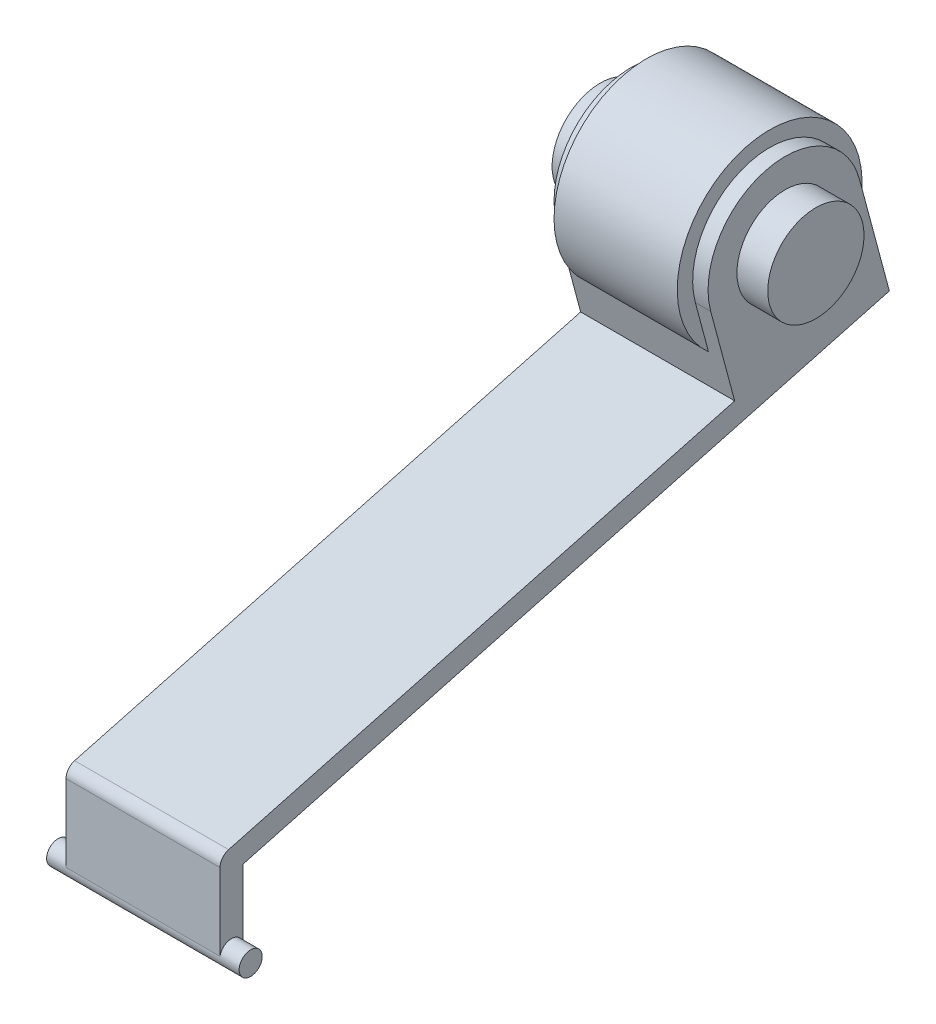
ISO-10303-21;
HEADER;
FILE_DESCRIPTION(('STEP AP214'),'2;1');
FILE_NAME('part.step','',(''),(''),'','','');
FILE_SCHEMA(('AUTOMOTIVE_DESIGN { 1 0 10303 214 1 1 1 1 }'));
ENDSEC;
DATA;
#1=APPLICATION_CONTEXT('core data for automotive mechanical design processes');
#2=APPLICATION_PROTOCOL_DEFINITION('international standard','automotive_design',2000,#1);
#3=PRODUCT_CONTEXT('',#1,'mechanical');
#4=PRODUCT('Part','Part','',(#3));
#5=PRODUCT_RELATED_PRODUCT_CATEGORY('part','',(#4));
#6=PRODUCT_DEFINITION_FORMATION('','',#4);
#7=PRODUCT_DEFINITION_CONTEXT('part definition',#1,'design');
#8=PRODUCT_DEFINITION('design','',#6,#7);
#9=PRODUCT_DEFINITION_SHAPE('','',#8);
#10=(LENGTH_UNIT() NAMED_UNIT(*) SI_UNIT(.MILLI.,.METRE.));
#11=(NAMED_UNIT(*) PLANE_ANGLE_UNIT() SI_UNIT($,.RADIAN.));
#12=(NAMED_UNIT(*) SI_UNIT($,.STERADIAN.) SOLID_ANGLE_UNIT());
#13=UNCERTAINTY_MEASURE_WITH_UNIT(LENGTH_MEASURE(1.E-05),#10,'distance_accuracy_value','');
#14=(GEOMETRIC_REPRESENTATION_CONTEXT(3) GLOBAL_UNCERTAINTY_ASSIGNED_CONTEXT((#13)) GLOBAL_UNIT_ASSIGNED_CONTEXT((#10,
#11,#12)) REPRESENTATION_CONTEXT('',''));
#15=CARTESIAN_POINT('',(0.,0.,0.));
#16=DIRECTION('',(0.,0.,1.));
#17=DIRECTION('',(1.,0.,0.));
#18=AXIS2_PLACEMENT_3D('',#15,#16,#17);
#19=CARTESIAN_POINT('',(-2.,8.1855285349606,-12.4450213943224));
#20=DIRECTION('',(0.,-0.258819045102509,0.965925826289071));
#21=DIRECTION('',(0.,-0.965925826289071,-0.258819045102509));
#22=AXIS2_PLACEMENT_3D('',#19,#20,#21);
#23=PLANE('',#22);
#24=DIRECTION('',(1.,0.,0.));
#25=VECTOR('',#24,1.);
#26=CARTESIAN_POINT('',(-1.6,6.90408311851465,-12.7883836588037));
#27=LINE('',#26,#25);
#28=CARTESIAN_POINT('',(-1.6,6.90408311851465,-12.7883836588037));
#29=VERTEX_POINT('',#28);
#30=CARTESIAN_POINT('',(1.6,6.90408311851465,-12.7883836588037));
#31=VERTEX_POINT('',#30);
#32=EDGE_CURVE('E61',#29,#31,#27,.T.);
#33=ORIENTED_EDGE('',*,*,#32,.F.);
#34=DIRECTION('',(0.,0.965925826289071,0.258819045102509));
#35=VECTOR('',#34,1.);
#36=CARTESIAN_POINT('',(-1.6,8.1855285349606,-12.4450213943224));
#37=LINE('',#36,#35);
#38=CARTESIAN_POINT('',(-1.6,8.1855285349606,-12.4450213943224));
#39=VERTEX_POINT('',#38);
#40=EDGE_CURVE('E191',#29,#39,#37,.T.);
#41=ORIENTED_EDGE('',*,*,#40,.T.);
#42=DIRECTION('',(1.,0.,0.));
#43=VECTOR('',#42,1.);
#44=CARTESIAN_POINT('',(-2.,8.1855285349606,-12.4450213943224));
#45=LINE('',#44,#43);
#46=CARTESIAN_POINT('',(-2.,8.1855285349606,-12.4450213943224));
#47=VERTEX_POINT('',#46);
#48=EDGE_CURVE('E220',#47,#39,#45,.T.);
#49=ORIENTED_EDGE('',*,*,#48,.F.);
#50=DIRECTION('',(0.,-0.965925826289071,-0.258819045102509));
#51=VECTOR('',#50,1.);
#52=CARTESIAN_POINT('',(-2.,8.1855285349606,-12.4450213943224));
#53=LINE('',#52,#51);
#54=CARTESIAN_POINT('',(-2.,5.85998708642784,-13.0681483474219));
#55=VERTEX_POINT('',#54);
#56=EDGE_CURVE('E197',#47,#55,#53,.T.);
#57=ORIENTED_EDGE('',*,*,#56,.T.);
#58=DIRECTION('',(1.,0.,0.));
#59=VECTOR('',#58,1.);
#60=CARTESIAN_POINT('',(-2.,5.85998708642784,-13.0681483474219));
#61=LINE('',#60,#59);
#62=CARTESIAN_POINT('',(2.,5.85998708642784,-13.0681483474219));
#63=VERTEX_POINT('',#62);
#64=EDGE_CURVE('E224',#55,#63,#61,.T.);
#65=ORIENTED_EDGE('',*,*,#64,.T.);
#66=DIRECTION('',(0.,-0.965925826289071,-0.258819045102509));
#67=VECTOR('',#66,1.);
#68=CARTESIAN_POINT('',(2.,8.1855285349606,-12.4450213943224));
#69=LINE('',#68,#67);
#70=CARTESIAN_POINT('',(2.,8.1855285349606,-12.4450213943224));
#71=VERTEX_POINT('',#70);
#72=EDGE_CURVE('E196',#71,#63,#69,.T.);
#73=ORIENTED_EDGE('',*,*,#72,.F.);
#74=CARTESIAN_POINT('',(1.6,8.1855285349606,-12.4450213943224));
#75=VERTEX_POINT('',#74);
#76=EDGE_CURVE('E225',#75,#71,#45,.T.);
#77=ORIENTED_EDGE('',*,*,#76,.F.);
#78=DIRECTION('',(0.,0.965925826289071,0.258819045102509));
#79=VECTOR('',#78,1.);
#80=CARTESIAN_POINT('',(1.6,8.1855285349606,-12.4450213943224));
#81=LINE('',#80,#79);
#82=EDGE_CURVE('E69',#31,#75,#81,.T.);
#83=ORIENTED_EDGE('',*,*,#82,.F.);
#84=EDGE_LOOP('',(#33,#41,#49,#57,#65,#73,#77,#83));
#85=FACE_BOUND('',#84,.T.);
#86=ADVANCED_FACE('F40',(#85),#23,.T.);
#87=CARTESIAN_POINT('',(-2.,8.70316662516563,-14.3768730469006));
#88=DIRECTION('',(1.,0.,0.));
#89=DIRECTION('',(0.,0.,-1.));
#90=AXIS2_PLACEMENT_3D('',#87,#88,#89);
#91=CYLINDRICAL_SURFACE('',#90,1.99999999999998);
#92=ORIENTED_EDGE('',*,*,#48,.T.);
#93=CARTESIAN_POINT('',(-1.6,8.70316662516563,-14.3768730469006));
#94=DIRECTION('',(1.,0.,0.));
#95=DIRECTION('',(0.,0.,-1.));
#96=AXIS2_PLACEMENT_3D('',#93,#94,#95);
#97=CIRCLE('',#96,1.99999999999998);
#98=CARTESIAN_POINT('',(-1.6,9.22080471537066,-16.3087246994787));
#99=VERTEX_POINT('',#98);
#100=EDGE_CURVE('E188',#39,#99,#97,.F.);
#101=ORIENTED_EDGE('',*,*,#100,.T.);
#102=DIRECTION('',(1.,0.,0.));
#103=VECTOR('',#102,1.);
#104=CARTESIAN_POINT('',(-2.,9.22080471537066,-16.3087246994787));
#105=LINE('',#104,#103);
#106=CARTESIAN_POINT('',(-2.,9.22080471537066,-16.3087246994787));
#107=VERTEX_POINT('',#106);
#108=EDGE_CURVE('E226',#107,#99,#105,.T.);
#109=ORIENTED_EDGE('',*,*,#108,.F.);
#110=CARTESIAN_POINT('',(-2.,8.70316662516563,-14.3768730469006));
#111=DIRECTION('',(1.,0.,0.));
#112=DIRECTION('',(0.,0.,-1.));
#113=AXIS2_PLACEMENT_3D('',#110,#111,#112);
#114=CIRCLE('',#113,1.99999999999998);
#115=EDGE_CURVE('E205',#107,#47,#114,.T.);
#116=ORIENTED_EDGE('',*,*,#115,.T.);
#117=EDGE_LOOP('',(#92,#101,#109,#116));
#118=FACE_BOUND('',#117,.T.);
#119=ADVANCED_FACE('F309',(#118),#91,.T.);
#120=CARTESIAN_POINT('',(-2.,6.32302723650344,-17.0851818347863));
#121=DIRECTION('',(0.,0.258819045102519,-0.965925826289069));
#122=DIRECTION('',(0.,0.965925826289069,0.258819045102519));
#123=AXIS2_PLACEMENT_3D('',#120,#121,#122);
#124=PLANE('',#123);
#125=ORIENTED_EDGE('',*,*,#108,.T.);
#126=DIRECTION('',(0.,-0.965925826289069,-0.258819045102519));
#127=VECTOR('',#126,1.);
#128=CARTESIAN_POINT('',(-1.6,6.32302723650344,-17.0851818347863));
#129=LINE('',#128,#127);
#130=CARTESIAN_POINT('',(-1.6,7.93935929892469,-16.6520869639599));
#131=VERTEX_POINT('',#130);
#132=EDGE_CURVE('E50',#99,#131,#129,.T.);
#133=ORIENTED_EDGE('',*,*,#132,.T.);
#134=DIRECTION('',(1.,0.,0.));
#135=VECTOR('',#134,1.);
#136=CARTESIAN_POINT('',(-1.6,7.93935929892469,-16.6520869639599));
#137=LINE('',#136,#135);
#138=CARTESIAN_POINT('',(1.6,7.93935929892469,-16.6520869639599));
#139=VERTEX_POINT('',#138);
#140=EDGE_CURVE('E150',#139,#131,#137,.F.);
#141=ORIENTED_EDGE('',*,*,#140,.F.);
#142=DIRECTION('',(0.,-0.965925826289069,-0.258819045102519));
#143=VECTOR('',#142,1.);
#144=CARTESIAN_POINT('',(1.6,6.32302723650344,-17.0851818347863));
#145=LINE('',#144,#143);
#146=CARTESIAN_POINT('',(1.6,9.22080471537066,-16.3087246994787));
#147=VERTEX_POINT('',#146);
#148=EDGE_CURVE('E154',#147,#139,#145,.T.);
#149=ORIENTED_EDGE('',*,*,#148,.F.);
#150=CARTESIAN_POINT('',(2.,9.22080471537066,-16.3087246994787));
#151=VERTEX_POINT('',#150);
#152=EDGE_CURVE('E229',#147,#151,#105,.T.);
#153=ORIENTED_EDGE('',*,*,#152,.T.);
#154=DIRECTION('',(0.,0.965925826289069,0.258819045102519));
#155=VECTOR('',#154,1.);
#156=CARTESIAN_POINT('',(2.,6.32302723650344,-17.0851818347863));
#157=LINE('',#156,#155);
#158=CARTESIAN_POINT('',(2.,6.32302723650344,-17.0851818347863));
#159=VERTEX_POINT('',#158);
#160=EDGE_CURVE('E213',#159,#151,#157,.T.);
#161=ORIENTED_EDGE('',*,*,#160,.F.);
#162=DIRECTION('',(1.,0.,0.));
#163=VECTOR('',#162,1.);
#164=CARTESIAN_POINT('',(-2.,6.32302723650344,-17.0851818347863));
#165=LINE('',#164,#163);
#166=CARTESIAN_POINT('',(-2.,6.32302723650344,-17.0851818347863));
#167=VERTEX_POINT('',#166);
#168=EDGE_CURVE('E209',#167,#159,#165,.T.);
#169=ORIENTED_EDGE('',*,*,#168,.F.);
#170=DIRECTION('',(0.,0.965925826289069,0.258819045102519));
#171=VECTOR('',#170,1.);
#172=CARTESIAN_POINT('',(-2.,6.32302723650344,-17.0851818347863));
#173=LINE('',#172,#171);
#174=EDGE_CURVE('E200',#167,#107,#173,.T.);
#175=ORIENTED_EDGE('',*,*,#174,.T.);
#176=EDGE_LOOP('',(#125,#133,#141,#149,#153,#161,#169,#175));
#177=FACE_BOUND('',#176,.T.);
#178=ADVANCED_FACE('F153',(#177),#124,.T.);
#179=CARTESIAN_POINT('',(2.5,0.,0.));
#180=DIRECTION('',(-1.,0.,0.));
#181=DIRECTION('',(0.,0.,1.));
#182=AXIS2_PLACEMENT_3D('',#179,#180,#181);
#183=CYLINDRICAL_SURFACE('',#182,0.3);
#184=DIRECTION('',(1.,0.,0.));
#185=VECTOR('',#184,1.);
#186=CARTESIAN_POINT('',(-2.,0.047528362088004,0.29621116588885));
#187=LINE('',#186,#185);
#188=CARTESIAN_POINT('',(-2.,0.0475283620880039,0.29621116588885));
#189=VERTEX_POINT('',#188);
#190=CARTESIAN_POINT('',(2.,0.0475283620880039,0.29621116588885));
#191=VERTEX_POINT('',#190);
#192=EDGE_CURVE('E265',#189,#191,#187,.T.);
#193=ORIENTED_EDGE('',*,*,#192,.F.);
#194=CARTESIAN_POINT('',(-2.,0.,0.));
#195=DIRECTION('',(-1.,0.,0.));
#196=DIRECTION('',(0.,0.,1.));
#197=AXIS2_PLACEMENT_3D('',#194,#195,#196);
#198=CIRCLE('',#197,0.3);
#199=CARTESIAN_POINT('',(-2.,0.0475283620880039,-0.29621116588885));
#200=VERTEX_POINT('',#199);
#201=EDGE_CURVE('E170',#189,#200,#198,.T.);
#202=ORIENTED_EDGE('',*,*,#201,.T.);
#203=DIRECTION('',(1.,0.,0.));
#204=VECTOR('',#203,1.);
#205=CARTESIAN_POINT('',(-2.,0.047528362088004,-0.29621116588885));
#206=LINE('',#205,#204);
#207=CARTESIAN_POINT('',(2.,0.047528362088004,-0.29621116588885));
#208=VERTEX_POINT('',#207);
#209=EDGE_CURVE('E264',#200,#208,#206,.T.);
#210=ORIENTED_EDGE('',*,*,#209,.T.);
#211=CARTESIAN_POINT('',(2.,0.,0.));
#212=DIRECTION('',(-1.,0.,0.));
#213=DIRECTION('',(0.,0.,1.));
#214=AXIS2_PLACEMENT_3D('',#211,#212,#213);
#215=CIRCLE('',#214,0.3);
#216=EDGE_CURVE('E280',#191,#208,#215,.T.);
#217=ORIENTED_EDGE('',*,*,#216,.F.);
#218=EDGE_LOOP('',(#193,#202,#210,#217));
#219=FACE_BOUND('',#218,.T.);
#220=CARTESIAN_POINT('',(2.5,0.,0.));
#221=DIRECTION('',(1.,0.,0.));
#222=DIRECTION('',(0.,0.,-1.));
#223=AXIS2_PLACEMENT_3D('',#220,#221,#222);
#224=CIRCLE('',#223,0.3);
#225=CARTESIAN_POINT('',(2.5,0.,-0.3));
#226=VERTEX_POINT('',#225);
#227=EDGE_CURVE('E277',#226,#226,#224,.T.);
#228=ORIENTED_EDGE('',*,*,#227,.F.);
#229=EDGE_LOOP('',(#228));
#230=FACE_BOUND('',#229,.T.);
#231=CARTESIAN_POINT('',(-2.5,0.,0.));
#232=DIRECTION('',(1.,0.,0.));
#233=DIRECTION('',(0.,0.,-1.));
#234=AXIS2_PLACEMENT_3D('',#231,#232,#233);
#235=CIRCLE('',#234,0.3);
#236=CARTESIAN_POINT('',(-2.5,0.,-0.3));
#237=VERTEX_POINT('',#236);
#238=EDGE_CURVE('E268',#237,#237,#235,.T.);
#239=ORIENTED_EDGE('',*,*,#238,.T.);
#240=EDGE_LOOP('',(#239));
#241=FACE_BOUND('',#240,.T.);
#242=ADVANCED_FACE('F42',(#219,#230,#241),#183,.T.);
#243=CARTESIAN_POINT('',(2.5,0.,0.));
#244=DIRECTION('',(1.,0.,0.));
#245=DIRECTION('',(0.,0.,-1.));
#246=AXIS2_PLACEMENT_3D('',#243,#244,#245);
#247=PLANE('',#246);
#248=ORIENTED_EDGE('',*,*,#227,.T.);
#249=EDGE_LOOP('',(#248));
#250=FACE_BOUND('',#249,.T.);
#251=ADVANCED_FACE('F348',(#250),#247,.T.);
#252=CARTESIAN_POINT('',(-2.5,0.,0.));
#253=DIRECTION('',(1.,0.,0.));
#254=DIRECTION('',(0.,0.,-1.));
#255=AXIS2_PLACEMENT_3D('',#252,#253,#254);
#256=PLANE('',#255);
#257=ORIENTED_EDGE('',*,*,#238,.F.);
#258=EDGE_LOOP('',(#257));
#259=FACE_BOUND('',#258,.T.);
#260=ADVANCED_FACE('F332',(#259),#256,.F.);
#261=CARTESIAN_POINT('',(-2.,0.047528362088004,0.29621116588885));
#262=DIRECTION('',(0.,0.,1.));
#263=DIRECTION('',(0.,-1.,0.));
#264=AXIS2_PLACEMENT_3D('',#261,#262,#263);
#265=PLANE('',#264);
#266=ORIENTED_EDGE('',*,*,#192,.T.);
#267=DIRECTION('',(0.,-1.,0.));
#268=VECTOR('',#267,1.);
#269=CARTESIAN_POINT('',(2.,0.047528362088004,0.29621116588885));
#270=LINE('',#269,#268);
#271=CARTESIAN_POINT('',(2.,2.047528362088,0.296211165888849));
#272=VERTEX_POINT('',#271);
#273=EDGE_CURVE('E246',#272,#191,#270,.T.);
#274=ORIENTED_EDGE('',*,*,#273,.F.);
#275=DIRECTION('',(1.,0.,0.));
#276=VECTOR('',#275,1.);
#277=CARTESIAN_POINT('',(-2.,2.047528362088,0.296211165888849));
#278=LINE('',#277,#276);
#279=CARTESIAN_POINT('',(-2.,2.047528362088,0.296211165888849));
#280=VERTEX_POINT('',#279);
#281=EDGE_CURVE('E269',#280,#272,#278,.T.);
#282=ORIENTED_EDGE('',*,*,#281,.F.);
#283=DIRECTION('',(0.,-1.,0.));
#284=VECTOR('',#283,1.);
#285=CARTESIAN_POINT('',(-2.,0.047528362088004,0.29621116588885));
#286=LINE('',#285,#284);
#287=EDGE_CURVE('E261',#280,#189,#286,.T.);
#288=ORIENTED_EDGE('',*,*,#287,.T.);
#289=EDGE_LOOP('',(#266,#274,#282,#288));
#290=FACE_BOUND('',#289,.T.);
#291=ADVANCED_FACE('F328',(#290),#265,.T.);
#292=CARTESIAN_POINT('',(-2.,2.047528362088,-0.00547167469361001));
#293=DIRECTION('',(1.,0.,0.));
#294=DIRECTION('',(0.,0.,-1.));
#295=AXIS2_PLACEMENT_3D('',#292,#293,#294);
#296=CYLINDRICAL_SURFACE('',#295,0.301682840582459);
#297=ORIENTED_EDGE('',*,*,#281,.T.);
#298=CARTESIAN_POINT('',(2.,2.047528362088,-0.00547167469361001));
#299=DIRECTION('',(1.,0.,0.));
#300=DIRECTION('',(0.,0.,1.));
#301=AXIS2_PLACEMENT_3D('',#298,#299,#300);
#302=CIRCLE('',#301,0.301682840582459);
#303=CARTESIAN_POINT('',(2.,2.33893160915485,0.0726095900297573));
#304=VERTEX_POINT('',#303);
#305=EDGE_CURVE('E243',#304,#272,#302,.T.);
#306=ORIENTED_EDGE('',*,*,#305,.F.);
#307=DIRECTION('',(1.,0.,0.));
#308=VECTOR('',#307,1.);
#309=CARTESIAN_POINT('',(-2.,2.33893160915485,0.0726095900297573));
#310=LINE('',#309,#308);
#311=CARTESIAN_POINT('',(-2.,2.33893160915485,0.0726095900297573));
#312=VERTEX_POINT('',#311);
#313=EDGE_CURVE('E271',#312,#304,#310,.T.);
#314=ORIENTED_EDGE('',*,*,#313,.F.);
#315=CARTESIAN_POINT('',(-2.,2.047528362088,-0.00547167469361001));
#316=DIRECTION('',(1.,0.,0.));
#317=DIRECTION('',(0.,0.,1.));
#318=AXIS2_PLACEMENT_3D('',#315,#316,#317);
#319=CIRCLE('',#318,0.301682840582459);
#320=EDGE_CURVE('E258',#312,#280,#319,.T.);
#321=ORIENTED_EDGE('',*,*,#320,.T.);
#322=EDGE_LOOP('',(#297,#306,#314,#321));
#323=FACE_BOUND('',#322,.T.);
#324=ADVANCED_FACE('F331',(#323),#296,.T.);
#325=CARTESIAN_POINT('',(-2.,2.33893160915485,0.0726095900297573));
#326=DIRECTION('',(0.,0.965925826289069,0.258819045102518));
#327=DIRECTION('',(0.,-0.258819045102518,0.965925826289069));
#328=AXIS2_PLACEMENT_3D('',#325,#326,#327);
#329=PLANE('',#328);
#330=ORIENTED_EDGE('',*,*,#64,.F.);
#331=DIRECTION('',(0.,-0.258819045102518,0.965925826289069));
#332=VECTOR('',#331,1.);
#333=CARTESIAN_POINT('',(-2.,2.33893160915485,0.0726095900297573));
#334=LINE('',#333,#332);
#335=EDGE_CURVE('E255',#55,#312,#334,.T.);
#336=ORIENTED_EDGE('',*,*,#335,.T.);
#337=ORIENTED_EDGE('',*,*,#313,.T.);
#338=DIRECTION('',(0.,-0.258819045102518,0.965925826289069));
#339=VECTOR('',#338,1.);
#340=CARTESIAN_POINT('',(2.,2.33893160915485,0.0726095900297573));
#341=LINE('',#340,#339);
#342=EDGE_CURVE('E240',#63,#304,#341,.T.);
#343=ORIENTED_EDGE('',*,*,#342,.F.);
#344=EDGE_LOOP('',(#330,#336,#337,#343));
#345=FACE_BOUND('',#344,.T.);
#346=ADVANCED_FACE('F336',(#345),#329,.T.);
#347=CARTESIAN_POINT('',(-2.,1.82443610402263,-0.29621116588885));
#348=DIRECTION('',(0.,-0.965925826289069,-0.258819045102518));
#349=DIRECTION('',(0.,0.258819045102518,-0.965925826289069));
#350=AXIS2_PLACEMENT_3D('',#347,#348,#349);
#351=PLANE('',#350);
#352=DIRECTION('',(0.,0.258819045102518,-0.965925826289069));
#353=VECTOR('',#352,1.);
#354=CARTESIAN_POINT('',(-2.,1.82443610402263,-0.29621116588885));
#355=LINE('',#354,#353);
#356=CARTESIAN_POINT('',(-2.,1.82443610402263,-0.29621116588885));
#357=VERTEX_POINT('',#356);
#358=EDGE_CURVE('E252',#357,#167,#355,.T.);
#359=ORIENTED_EDGE('',*,*,#358,.T.);
#360=ORIENTED_EDGE('',*,*,#168,.T.);
#361=DIRECTION('',(0.,0.258819045102518,-0.965925826289069));
#362=VECTOR('',#361,1.);
#363=CARTESIAN_POINT('',(2.,1.82443610402263,-0.29621116588885));
#364=LINE('',#363,#362);
#365=CARTESIAN_POINT('',(2.,1.82443610402263,-0.29621116588885));
#366=VERTEX_POINT('',#365);
#367=EDGE_CURVE('E237',#366,#159,#364,.T.);
#368=ORIENTED_EDGE('',*,*,#367,.F.);
#369=DIRECTION('',(1.,0.,0.));
#370=VECTOR('',#369,1.);
#371=CARTESIAN_POINT('',(-2.,1.82443610402263,-0.29621116588885));
#372=LINE('',#371,#370);
#373=EDGE_CURVE('E274',#357,#366,#372,.T.);
#374=ORIENTED_EDGE('',*,*,#373,.F.);
#375=EDGE_LOOP('',(#359,#360,#368,#374));
#376=FACE_BOUND('',#375,.T.);
#377=ADVANCED_FACE('F340',(#376),#351,.T.);
#378=CARTESIAN_POINT('',(-2.,1.82443610402263,-0.29621116588885));
#379=DIRECTION('',(0.,0.,-1.));
#380=DIRECTION('',(0.,1.,0.));
#381=AXIS2_PLACEMENT_3D('',#378,#379,#380);
#382=PLANE('',#381);
#383=ORIENTED_EDGE('',*,*,#373,.T.);
#384=DIRECTION('',(0.,1.,0.));
#385=VECTOR('',#384,1.);
#386=CARTESIAN_POINT('',(2.,1.82443610402263,-0.29621116588885));
#387=LINE('',#386,#385);
#388=EDGE_CURVE('E234',#208,#366,#387,.T.);
#389=ORIENTED_EDGE('',*,*,#388,.F.);
#390=ORIENTED_EDGE('',*,*,#209,.F.);
#391=DIRECTION('',(0.,1.,0.));
#392=VECTOR('',#391,1.);
#393=CARTESIAN_POINT('',(-2.,1.82443610402263,-0.29621116588885));
#394=LINE('',#393,#392);
#395=EDGE_CURVE('E249',#200,#357,#394,.T.);
#396=ORIENTED_EDGE('',*,*,#395,.T.);
#397=EDGE_LOOP('',(#383,#389,#390,#396));
#398=FACE_BOUND('',#397,.T.);
#399=ADVANCED_FACE('F326',(#398),#382,.T.);
#400=CARTESIAN_POINT('',(-2.,2.047528362088,-0.00547167469361001));
#401=DIRECTION('',(-1.,0.,0.));
#402=DIRECTION('',(0.,0.,1.));
#403=AXIS2_PLACEMENT_3D('',#400,#401,#402);
#404=PLANE('',#403);
#405=CARTESIAN_POINT('',(-2.,8.70316662516563,-14.3768730469006));
#406=DIRECTION('',(-1.,0.,0.));
#407=DIRECTION('',(0.,0.,1.));
#408=AXIS2_PLACEMENT_3D('',#405,#406,#407);
#409=CIRCLE('',#408,1.25);
#410=CARTESIAN_POINT('',(-2.,8.70316662516563,-13.1268730469006));
#411=VERTEX_POINT('',#410);
#412=EDGE_CURVE('E11',#411,#411,#409,.T.);
#413=ORIENTED_EDGE('',*,*,#412,.F.);
#414=EDGE_LOOP('',(#413));
#415=FACE_BOUND('',#414,.T.);
#416=ORIENTED_EDGE('',*,*,#335,.F.);
#417=ORIENTED_EDGE('',*,*,#56,.F.);
#418=ORIENTED_EDGE('',*,*,#115,.F.);
#419=ORIENTED_EDGE('',*,*,#174,.F.);
#420=ORIENTED_EDGE('',*,*,#358,.F.);
#421=ORIENTED_EDGE('',*,*,#395,.F.);
#422=ORIENTED_EDGE('',*,*,#201,.F.);
#423=ORIENTED_EDGE('',*,*,#287,.F.);
#424=ORIENTED_EDGE('',*,*,#320,.F.);
#425=EDGE_LOOP('',(#416,#417,#418,#419,#420,#421,#422,#423,#424));
#426=FACE_BOUND('',#425,.T.);
#427=ADVANCED_FACE('F322',(#415,#426),#404,.T.);
#428=CARTESIAN_POINT('',(2.,2.047528362088,-0.00547167469361001));
#429=DIRECTION('',(-1.,0.,0.));
#430=DIRECTION('',(0.,0.,1.));
#431=AXIS2_PLACEMENT_3D('',#428,#429,#430);
#432=PLANE('',#431);
#433=CARTESIAN_POINT('',(2.,8.70316662516563,-14.3768730469006));
#434=DIRECTION('',(-1.,0.,0.));
#435=DIRECTION('',(0.,0.,1.));
#436=AXIS2_PLACEMENT_3D('',#433,#434,#435);
#437=CIRCLE('',#436,1.25);
#438=CARTESIAN_POINT('',(2.,8.70316662516563,-13.1268730469006));
#439=VERTEX_POINT('',#438);
#440=EDGE_CURVE('E44',#439,#439,#437,.T.);
#441=ORIENTED_EDGE('',*,*,#440,.T.);
#442=EDGE_LOOP('',(#441));
#443=FACE_BOUND('',#442,.T.);
#444=ORIENTED_EDGE('',*,*,#72,.T.);
#445=ORIENTED_EDGE('',*,*,#342,.T.);
#446=ORIENTED_EDGE('',*,*,#305,.T.);
#447=ORIENTED_EDGE('',*,*,#273,.T.);
#448=ORIENTED_EDGE('',*,*,#216,.T.);
#449=ORIENTED_EDGE('',*,*,#388,.T.);
#450=ORIENTED_EDGE('',*,*,#367,.T.);
#451=ORIENTED_EDGE('',*,*,#160,.T.);
#452=CARTESIAN_POINT('',(2.,8.70316662516563,-14.3768730469006));
#453=DIRECTION('',(1.,0.,0.));
#454=DIRECTION('',(0.,0.,-1.));
#455=AXIS2_PLACEMENT_3D('',#452,#453,#454);
#456=CIRCLE('',#455,1.99999999999998);
#457=EDGE_CURVE('E201',#151,#71,#456,.T.);
#458=ORIENTED_EDGE('',*,*,#457,.T.);
#459=EDGE_LOOP('',(#444,#445,#446,#447,#448,#449,#450,#451,#458));
#460=FACE_BOUND('',#459,.T.);
#461=ADVANCED_FACE('F319',(#443,#460),#432,.F.);
#462=CARTESIAN_POINT('',(1.6,8.70316662516563,-14.3768730469006));
#463=DIRECTION('',(1.,0.,0.));
#464=DIRECTION('',(0.,0.,-1.));
#465=AXIS2_PLACEMENT_3D('',#462,#463,#464);
#466=CIRCLE('',#465,1.99999999999998);
#467=EDGE_CURVE('E168',#75,#147,#466,.F.);
#468=ORIENTED_EDGE('',*,*,#467,.F.);
#469=ORIENTED_EDGE('',*,*,#76,.T.);
#470=ORIENTED_EDGE('',*,*,#457,.F.);
#471=ORIENTED_EDGE('',*,*,#152,.F.);
#472=EDGE_LOOP('',(#468,#469,#470,#471));
#473=FACE_BOUND('',#472,.T.);
#474=ADVANCED_FACE('F316',(#473),#91,.T.);
#475=CARTESIAN_POINT('',(-1.6,8.70316662516563,-14.3768730469006));
#476=DIRECTION('',(1.,0.,0.));
#477=DIRECTION('',(0.,0.,-1.));
#478=AXIS2_PLACEMENT_3D('',#475,#476,#477);
#479=CYLINDRICAL_SURFACE('',#478,2.4);
#480=CARTESIAN_POINT('',(-1.6,8.70316662516563,-14.3768730469006));
#481=DIRECTION('',(1.,0.,0.));
#482=DIRECTION('',(0.,0.,-1.));
#483=AXIS2_PLACEMENT_3D('',#480,#481,#482);
#484=CIRCLE('',#483,2.4);
#485=EDGE_CURVE('E174',#131,#29,#484,.T.);
#486=ORIENTED_EDGE('',*,*,#485,.T.);
#487=ORIENTED_EDGE('',*,*,#32,.T.);
#488=CARTESIAN_POINT('',(1.6,8.70316662516563,-14.3768730469006));
#489=DIRECTION('',(1.,0.,0.));
#490=DIRECTION('',(0.,0.,-1.));
#491=AXIS2_PLACEMENT_3D('',#488,#489,#490);
#492=CIRCLE('',#491,2.4);
#493=EDGE_CURVE('E167',#139,#31,#492,.T.);
#494=ORIENTED_EDGE('',*,*,#493,.F.);
#495=ORIENTED_EDGE('',*,*,#140,.T.);
#496=EDGE_LOOP('',(#486,#487,#494,#495));
#497=FACE_BOUND('',#496,.T.);
#498=ADVANCED_FACE('F172',(#497),#479,.T.);
#499=CARTESIAN_POINT('',(-1.6,8.70316662516563,-14.3768730469006));
#500=DIRECTION('',(1.,0.,0.));
#501=DIRECTION('',(0.,0.,-1.));
#502=AXIS2_PLACEMENT_3D('',#499,#500,#501);
#503=PLANE('',#502);
#504=ORIENTED_EDGE('',*,*,#40,.F.);
#505=ORIENTED_EDGE('',*,*,#485,.F.);
#506=ORIENTED_EDGE('',*,*,#132,.F.);
#507=ORIENTED_EDGE('',*,*,#100,.F.);
#508=EDGE_LOOP('',(#504,#505,#506,#507));
#509=FACE_BOUND('',#508,.T.);
#510=ADVANCED_FACE('F390',(#509),#503,.F.);
#511=CARTESIAN_POINT('',(1.6,8.70316662516563,-14.3768730469006));
#512=DIRECTION('',(1.,0.,0.));
#513=DIRECTION('',(0.,0.,-1.));
#514=AXIS2_PLACEMENT_3D('',#511,#512,#513);
#515=PLANE('',#514);
#516=ORIENTED_EDGE('',*,*,#493,.T.);
#517=ORIENTED_EDGE('',*,*,#82,.T.);
#518=ORIENTED_EDGE('',*,*,#467,.T.);
#519=ORIENTED_EDGE('',*,*,#148,.T.);
#520=EDGE_LOOP('',(#516,#517,#518,#519));
#521=FACE_BOUND('',#520,.T.);
#522=ADVANCED_FACE('F166',(#521),#515,.T.);
#523=CARTESIAN_POINT('',(2.8,8.70316662516563,-14.3768730469006));
#524=DIRECTION('',(1.,0.,0.));
#525=DIRECTION('',(0.,0.,-1.));
#526=AXIS2_PLACEMENT_3D('',#523,#524,#525);
#527=PLANE('',#526);
#528=CARTESIAN_POINT('',(2.8,8.70316662516563,-14.3768730469006));
#529=DIRECTION('',(1.,0.,0.));
#530=DIRECTION('',(0.,0.,-1.));
#531=AXIS2_PLACEMENT_3D('',#528,#529,#530);
#532=CIRCLE('',#531,1.25);
#533=CARTESIAN_POINT('',(2.8,8.70316662516563,-15.6268730469006));
#534=VERTEX_POINT('',#533);
#535=EDGE_CURVE('E287',#534,#534,#532,.T.);
#536=ORIENTED_EDGE('',*,*,#535,.T.);
#537=EDGE_LOOP('',(#536));
#538=FACE_BOUND('',#537,.T.);
#539=ADVANCED_FACE('F397',(#538),#527,.T.);
#540=CARTESIAN_POINT('',(-2.8,8.70316662516563,-14.3768730469006));
#541=DIRECTION('',(1.,0.,0.));
#542=DIRECTION('',(0.,0.,-1.));
#543=AXIS2_PLACEMENT_3D('',#540,#541,#542);
#544=CYLINDRICAL_SURFACE('',#543,1.25);
#545=ORIENTED_EDGE('',*,*,#535,.F.);
#546=EDGE_LOOP('',(#545));
#547=FACE_BOUND('',#546,.T.);
#548=ORIENTED_EDGE('',*,*,#440,.F.);
#549=EDGE_LOOP('',(#548));
#550=FACE_BOUND('',#549,.T.);
#551=ADVANCED_FACE('F304',(#547,#550),#544,.T.);
#552=ORIENTED_EDGE('',*,*,#412,.T.);
#553=EDGE_LOOP('',(#552));
#554=FACE_BOUND('',#553,.T.);
#555=CARTESIAN_POINT('',(-2.8,8.70316662516563,-14.3768730469006));
#556=DIRECTION('',(1.,0.,0.));
#557=DIRECTION('',(0.,0.,-1.));
#558=AXIS2_PLACEMENT_3D('',#555,#556,#557);
#559=CIRCLE('',#558,1.25);
#560=CARTESIAN_POINT('',(-2.8,8.70316662516563,-15.6268730469006));
#561=VERTEX_POINT('',#560);
#562=EDGE_CURVE('E182',#561,#561,#559,.T.);
#563=ORIENTED_EDGE('',*,*,#562,.T.);
#564=EDGE_LOOP('',(#563));
#565=FACE_BOUND('',#564,.T.);
#566=ADVANCED_FACE('F296',(#554,#565),#544,.T.);
#567=CARTESIAN_POINT('',(-2.8,8.70316662516563,-14.3768730469006));
#568=DIRECTION('',(1.,0.,0.));
#569=DIRECTION('',(0.,0.,-1.));
#570=AXIS2_PLACEMENT_3D('',#567,#568,#569);
#571=PLANE('',#570);
#572=ORIENTED_EDGE('',*,*,#562,.F.);
#573=EDGE_LOOP('',(#572));
#574=FACE_BOUND('',#573,.T.);
#575=ADVANCED_FACE('F298',(#574),#571,.F.);
#576=CLOSED_SHELL('',(#86,#119,#178,#242,#251,#260,#291,#324,#346,#377,#399,#427,#461,#474,#498,
#510,#522,#539,#551,#566,#575));
#577=MANIFOLD_SOLID_BREP('B2',#576);
#578=ADVANCED_BREP_SHAPE_REPRESENTATION('',(#18,#577),#14);
#579=SHAPE_DEFINITION_REPRESENTATION(#9,#578);
ENDSEC;
END-ISO-10303-21;
